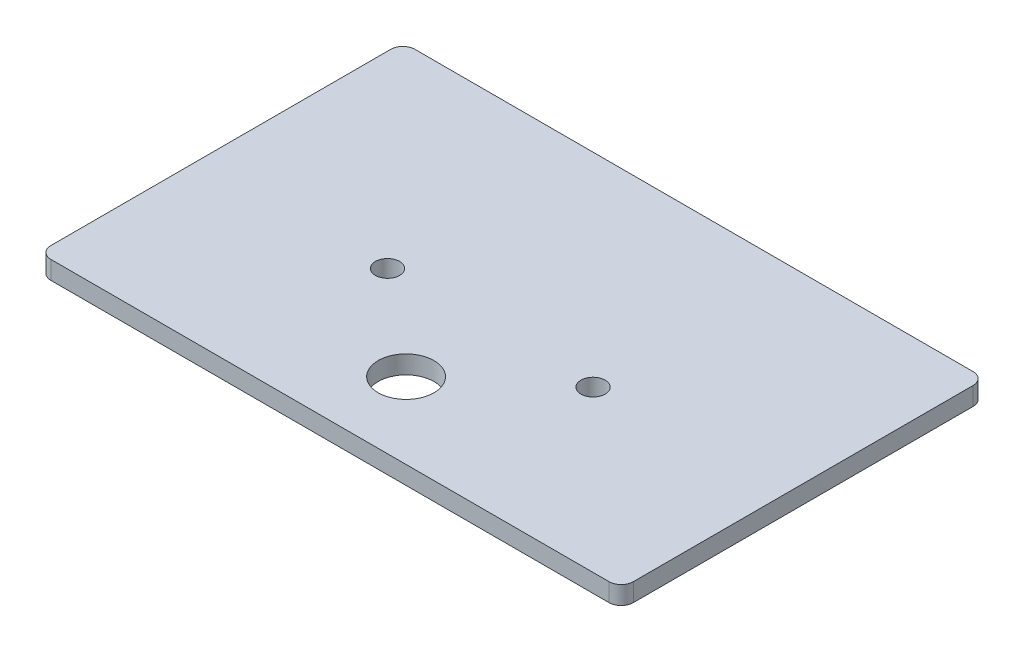
ISO-10303-21;
HEADER;
FILE_DESCRIPTION(('STEP AP214'),'2;1');
FILE_NAME('part.step','',(''),(''),'','','');
FILE_SCHEMA(('AUTOMOTIVE_DESIGN { 1 0 10303 214 1 1 1 1 }'));
ENDSEC;
DATA;
#1=APPLICATION_CONTEXT('core data for automotive mechanical design processes');
#2=APPLICATION_PROTOCOL_DEFINITION('international standard','automotive_design',2000,#1);
#3=PRODUCT_CONTEXT('',#1,'mechanical');
#4=PRODUCT('Part','Part','',(#3));
#5=PRODUCT_RELATED_PRODUCT_CATEGORY('part','',(#4));
#6=PRODUCT_DEFINITION_FORMATION('','',#4);
#7=PRODUCT_DEFINITION_CONTEXT('part definition',#1,'design');
#8=PRODUCT_DEFINITION('design','',#6,#7);
#9=PRODUCT_DEFINITION_SHAPE('','',#8);
#10=(LENGTH_UNIT() NAMED_UNIT(*) SI_UNIT(.MILLI.,.METRE.));
#11=(NAMED_UNIT(*) PLANE_ANGLE_UNIT() SI_UNIT($,.RADIAN.));
#12=(NAMED_UNIT(*) SI_UNIT($,.STERADIAN.) SOLID_ANGLE_UNIT());
#13=UNCERTAINTY_MEASURE_WITH_UNIT(LENGTH_MEASURE(1.E-05),#10,'distance_accuracy_value','');
#14=(GEOMETRIC_REPRESENTATION_CONTEXT(3) GLOBAL_UNCERTAINTY_ASSIGNED_CONTEXT((#13)) GLOBAL_UNIT_ASSIGNED_CONTEXT((#10,
#11,#12)) REPRESENTATION_CONTEXT('',''));
#15=CARTESIAN_POINT('',(0.,0.,0.));
#16=DIRECTION('',(0.,0.,1.));
#17=DIRECTION('',(1.,0.,0.));
#18=AXIS2_PLACEMENT_3D('',#15,#16,#17);
#19=CARTESIAN_POINT('',(36.,2.25,22.5));
#20=DIRECTION('',(-1.,0.,0.));
#21=DIRECTION('',(0.,0.,1.));
#22=AXIS2_PLACEMENT_3D('',#19,#20,#21);
#23=PLANE('',#22);
#24=DIRECTION('',(0.,0.,-1.));
#25=VECTOR('',#24,1.);
#26=CARTESIAN_POINT('',(36.,0.,22.5));
#27=LINE('',#26,#25);
#28=CARTESIAN_POINT('',(36.,0.,21.));
#29=VERTEX_POINT('',#28);
#30=CARTESIAN_POINT('',(36.,0.,-21.));
#31=VERTEX_POINT('',#30);
#32=EDGE_CURVE('E134',#29,#31,#27,.T.);
#33=ORIENTED_EDGE('',*,*,#32,.T.);
#34=DIRECTION('',(0.,-1.,0.));
#35=VECTOR('',#34,1.);
#36=CARTESIAN_POINT('',(36.,2.25,-21.));
#37=LINE('',#36,#35);
#38=CARTESIAN_POINT('',(36.,2.25,-21.));
#39=VERTEX_POINT('',#38);
#40=EDGE_CURVE('E152',#31,#39,#37,.F.);
#41=ORIENTED_EDGE('',*,*,#40,.T.);
#42=DIRECTION('',(0.,0.,-1.));
#43=VECTOR('',#42,1.);
#44=CARTESIAN_POINT('',(36.,2.25,22.5));
#45=LINE('',#44,#43);
#46=CARTESIAN_POINT('',(36.,2.25,21.));
#47=VERTEX_POINT('',#46);
#48=EDGE_CURVE('E132',#47,#39,#45,.T.);
#49=ORIENTED_EDGE('',*,*,#48,.F.);
#50=DIRECTION('',(0.,-1.,0.));
#51=VECTOR('',#50,1.);
#52=CARTESIAN_POINT('',(36.,2.25,21.));
#53=LINE('',#52,#51);
#54=EDGE_CURVE('E149',#47,#29,#53,.T.);
#55=ORIENTED_EDGE('',*,*,#54,.T.);
#56=EDGE_LOOP('',(#33,#41,#49,#55));
#57=FACE_BOUND('',#56,.T.);
#58=ADVANCED_FACE('F38',(#57),#23,.F.);
#59=CARTESIAN_POINT('',(-36.,2.25,-22.5));
#60=DIRECTION('',(0.,0.,1.));
#61=DIRECTION('',(1.,0.,0.));
#62=AXIS2_PLACEMENT_3D('',#59,#60,#61);
#63=PLANE('',#62);
#64=DIRECTION('',(-1.,0.,0.));
#65=VECTOR('',#64,1.);
#66=CARTESIAN_POINT('',(-36.,2.25,-22.5));
#67=LINE('',#66,#65);
#68=CARTESIAN_POINT('',(34.5,2.25,-22.5));
#69=VERTEX_POINT('',#68);
#70=CARTESIAN_POINT('',(-34.5,2.25,-22.5));
#71=VERTEX_POINT('',#70);
#72=EDGE_CURVE('E184',#69,#71,#67,.T.);
#73=ORIENTED_EDGE('',*,*,#72,.F.);
#74=DIRECTION('',(0.,-1.,0.));
#75=VECTOR('',#74,1.);
#76=CARTESIAN_POINT('',(34.5,2.25,-22.5));
#77=LINE('',#76,#75);
#78=CARTESIAN_POINT('',(34.5,0.,-22.5));
#79=VERTEX_POINT('',#78);
#80=EDGE_CURVE('E141',#69,#79,#77,.T.);
#81=ORIENTED_EDGE('',*,*,#80,.T.);
#82=DIRECTION('',(-1.,0.,0.));
#83=VECTOR('',#82,1.);
#84=CARTESIAN_POINT('',(-36.,0.,-22.5));
#85=LINE('',#84,#83);
#86=CARTESIAN_POINT('',(-34.5,0.,-22.5));
#87=VERTEX_POINT('',#86);
#88=EDGE_CURVE('E130',#79,#87,#85,.T.);
#89=ORIENTED_EDGE('',*,*,#88,.T.);
#90=DIRECTION('',(0.,-1.,0.));
#91=VECTOR('',#90,1.);
#92=CARTESIAN_POINT('',(-34.5,2.25,-22.5));
#93=LINE('',#92,#91);
#94=EDGE_CURVE('E112',#87,#71,#93,.F.);
#95=ORIENTED_EDGE('',*,*,#94,.T.);
#96=EDGE_LOOP('',(#73,#81,#89,#95));
#97=FACE_BOUND('',#96,.T.);
#98=ADVANCED_FACE('F200',(#97),#63,.F.);
#99=CARTESIAN_POINT('',(-36.,2.25,22.5));
#100=DIRECTION('',(1.,0.,0.));
#101=DIRECTION('',(0.,0.,-1.));
#102=AXIS2_PLACEMENT_3D('',#99,#100,#101);
#103=PLANE('',#102);
#104=DIRECTION('',(0.,0.,1.));
#105=VECTOR('',#104,1.);
#106=CARTESIAN_POINT('',(-36.,0.,22.5));
#107=LINE('',#106,#105);
#108=CARTESIAN_POINT('',(-36.,0.,-21.));
#109=VERTEX_POINT('',#108);
#110=CARTESIAN_POINT('',(-36.,0.,21.));
#111=VERTEX_POINT('',#110);
#112=EDGE_CURVE('E121',#109,#111,#107,.T.);
#113=ORIENTED_EDGE('',*,*,#112,.T.);
#114=DIRECTION('',(0.,-1.,0.));
#115=VECTOR('',#114,1.);
#116=CARTESIAN_POINT('',(-36.,2.25,21.));
#117=LINE('',#116,#115);
#118=CARTESIAN_POINT('',(-36.,2.25,21.));
#119=VERTEX_POINT('',#118);
#120=EDGE_CURVE('E11',#111,#119,#117,.F.);
#121=ORIENTED_EDGE('',*,*,#120,.T.);
#122=DIRECTION('',(0.,0.,1.));
#123=VECTOR('',#122,1.);
#124=CARTESIAN_POINT('',(-36.,2.25,22.5));
#125=LINE('',#124,#123);
#126=CARTESIAN_POINT('',(-36.,2.25,-21.));
#127=VERTEX_POINT('',#126);
#128=EDGE_CURVE('E123',#127,#119,#125,.T.);
#129=ORIENTED_EDGE('',*,*,#128,.F.);
#130=DIRECTION('',(0.,-1.,0.));
#131=VECTOR('',#130,1.);
#132=CARTESIAN_POINT('',(-36.,2.25,-21.));
#133=LINE('',#132,#131);
#134=EDGE_CURVE('E110',#127,#109,#133,.T.);
#135=ORIENTED_EDGE('',*,*,#134,.T.);
#136=EDGE_LOOP('',(#113,#121,#129,#135));
#137=FACE_BOUND('',#136,.T.);
#138=ADVANCED_FACE('F120',(#137),#103,.F.);
#139=CARTESIAN_POINT('',(-36.,2.25,22.5));
#140=DIRECTION('',(0.,0.,-1.));
#141=DIRECTION('',(-1.,0.,0.));
#142=AXIS2_PLACEMENT_3D('',#139,#140,#141);
#143=PLANE('',#142);
#144=DIRECTION('',(1.,0.,0.));
#145=VECTOR('',#144,1.);
#146=CARTESIAN_POINT('',(-36.,0.,22.5));
#147=LINE('',#146,#145);
#148=CARTESIAN_POINT('',(-34.5,0.,22.5));
#149=VERTEX_POINT('',#148);
#150=CARTESIAN_POINT('',(34.5,0.,22.5));
#151=VERTEX_POINT('',#150);
#152=EDGE_CURVE('E129',#149,#151,#147,.T.);
#153=ORIENTED_EDGE('',*,*,#152,.T.);
#154=DIRECTION('',(0.,-1.,0.));
#155=VECTOR('',#154,1.);
#156=CARTESIAN_POINT('',(34.5,2.25,22.5));
#157=LINE('',#156,#155);
#158=CARTESIAN_POINT('',(34.5,2.25,22.5));
#159=VERTEX_POINT('',#158);
#160=EDGE_CURVE('E47',#151,#159,#157,.F.);
#161=ORIENTED_EDGE('',*,*,#160,.T.);
#162=DIRECTION('',(1.,0.,0.));
#163=VECTOR('',#162,1.);
#164=CARTESIAN_POINT('',(-36.,2.25,22.5));
#165=LINE('',#164,#163);
#166=CARTESIAN_POINT('',(-34.5,2.25,22.5));
#167=VERTEX_POINT('',#166);
#168=EDGE_CURVE('E124',#167,#159,#165,.T.);
#169=ORIENTED_EDGE('',*,*,#168,.F.);
#170=DIRECTION('',(0.,-1.,0.));
#171=VECTOR('',#170,1.);
#172=CARTESIAN_POINT('',(-34.5,2.25,22.5));
#173=LINE('',#172,#171);
#174=EDGE_CURVE('E159',#167,#149,#173,.T.);
#175=ORIENTED_EDGE('',*,*,#174,.T.);
#176=EDGE_LOOP('',(#153,#161,#169,#175));
#177=FACE_BOUND('',#176,.T.);
#178=ADVANCED_FACE('F203',(#177),#143,.F.);
#179=CARTESIAN_POINT('',(0.,2.25,0.));
#180=DIRECTION('',(0.,-1.,0.));
#181=DIRECTION('',(0.,0.,-1.));
#182=AXIS2_PLACEMENT_3D('',#179,#180,#181);
#183=PLANE('',#182);
#184=CARTESIAN_POINT('',(-12.7348596341778,2.25,2.65687913250761));
#185=DIRECTION('',(0.,1.,0.));
#186=DIRECTION('',(0.,0.,1.));
#187=AXIS2_PLACEMENT_3D('',#184,#185,#186);
#188=CIRCLE('',#187,1.5);
#189=CARTESIAN_POINT('',(-12.7348596341778,2.25,4.15687913250761));
#190=VERTEX_POINT('',#189);
#191=EDGE_CURVE('E168',#190,#190,#188,.T.);
#192=ORIENTED_EDGE('',*,*,#191,.F.);
#193=EDGE_LOOP('',(#192));
#194=FACE_BOUND('',#193,.T.);
#195=CARTESIAN_POINT('',(12.682272564889,2.25,2.65687913250761));
#196=DIRECTION('',(0.,1.,0.));
#197=DIRECTION('',(0.,0.,1.));
#198=AXIS2_PLACEMENT_3D('',#195,#196,#197);
#199=CIRCLE('',#198,1.5);
#200=CARTESIAN_POINT('',(12.682272564889,2.25,4.15687913250761));
#201=VERTEX_POINT('',#200);
#202=EDGE_CURVE('E173',#201,#201,#199,.T.);
#203=ORIENTED_EDGE('',*,*,#202,.F.);
#204=EDGE_LOOP('',(#203));
#205=FACE_BOUND('',#204,.T.);
#206=CARTESIAN_POINT('',(0.,2.25,13.0972902551803));
#207=DIRECTION('',(0.,1.,0.));
#208=DIRECTION('',(0.,0.,1.));
#209=AXIS2_PLACEMENT_3D('',#206,#207,#208);
#210=CIRCLE('',#209,3.45);
#211=CARTESIAN_POINT('',(0.,2.25,16.5472902551803));
#212=VERTEX_POINT('',#211);
#213=EDGE_CURVE('E165',#212,#212,#210,.T.);
#214=ORIENTED_EDGE('',*,*,#213,.F.);
#215=EDGE_LOOP('',(#214));
#216=FACE_BOUND('',#215,.T.);
#217=ORIENTED_EDGE('',*,*,#48,.T.);
#218=CARTESIAN_POINT('',(34.5,2.25,-21.));
#219=DIRECTION('',(0.,-1.,0.));
#220=DIRECTION('',(0.,0.,-1.));
#221=AXIS2_PLACEMENT_3D('',#218,#219,#220);
#222=CIRCLE('',#221,1.5);
#223=EDGE_CURVE('E157',#39,#69,#222,.F.);
#224=ORIENTED_EDGE('',*,*,#223,.T.);
#225=ORIENTED_EDGE('',*,*,#72,.T.);
#226=CARTESIAN_POINT('',(-34.5,2.25,-21.));
#227=DIRECTION('',(0.,-1.,0.));
#228=DIRECTION('',(0.,0.,-1.));
#229=AXIS2_PLACEMENT_3D('',#226,#227,#228);
#230=CIRCLE('',#229,1.5);
#231=EDGE_CURVE('E139',#71,#127,#230,.F.);
#232=ORIENTED_EDGE('',*,*,#231,.T.);
#233=ORIENTED_EDGE('',*,*,#128,.T.);
#234=CARTESIAN_POINT('',(-34.5,2.25,21.));
#235=DIRECTION('',(0.,-1.,0.));
#236=DIRECTION('',(0.,0.,-1.));
#237=AXIS2_PLACEMENT_3D('',#234,#235,#236);
#238=CIRCLE('',#237,1.5);
#239=EDGE_CURVE('E61',#119,#167,#238,.F.);
#240=ORIENTED_EDGE('',*,*,#239,.T.);
#241=ORIENTED_EDGE('',*,*,#168,.T.);
#242=CARTESIAN_POINT('',(34.5,2.25,21.));
#243=DIRECTION('',(0.,-1.,0.));
#244=DIRECTION('',(0.,0.,-1.));
#245=AXIS2_PLACEMENT_3D('',#242,#243,#244);
#246=CIRCLE('',#245,1.5);
#247=EDGE_CURVE('E155',#159,#47,#246,.F.);
#248=ORIENTED_EDGE('',*,*,#247,.T.);
#249=EDGE_LOOP('',(#217,#224,#225,#232,#233,#240,#241,#248));
#250=FACE_BOUND('',#249,.T.);
#251=ADVANCED_FACE('F198',(#194,#205,#216,#250),#183,.F.);
#252=CARTESIAN_POINT('',(0.,0.,0.));
#253=DIRECTION('',(0.,-1.,0.));
#254=DIRECTION('',(0.,0.,-1.));
#255=AXIS2_PLACEMENT_3D('',#252,#253,#254);
#256=PLANE('',#255);
#257=CARTESIAN_POINT('',(-12.7348596341778,0.,2.65687913250761));
#258=DIRECTION('',(0.,-1.,0.));
#259=DIRECTION('',(0.,0.,-1.));
#260=AXIS2_PLACEMENT_3D('',#257,#258,#259);
#261=CIRCLE('',#260,1.5);
#262=CARTESIAN_POINT('',(-12.7348596341778,0.,1.15687913250761));
#263=VERTEX_POINT('',#262);
#264=EDGE_CURVE('E42',#263,#263,#261,.T.);
#265=ORIENTED_EDGE('',*,*,#264,.F.);
#266=EDGE_LOOP('',(#265));
#267=FACE_BOUND('',#266,.T.);
#268=CARTESIAN_POINT('',(12.682272564889,0.,2.65687913250761));
#269=DIRECTION('',(0.,-1.,0.));
#270=DIRECTION('',(0.,0.,-1.));
#271=AXIS2_PLACEMENT_3D('',#268,#269,#270);
#272=CIRCLE('',#271,1.5);
#273=CARTESIAN_POINT('',(12.682272564889,0.,1.15687913250761));
#274=VERTEX_POINT('',#273);
#275=EDGE_CURVE('E166',#274,#274,#272,.T.);
#276=ORIENTED_EDGE('',*,*,#275,.F.);
#277=EDGE_LOOP('',(#276));
#278=FACE_BOUND('',#277,.T.);
#279=CARTESIAN_POINT('',(0.,0.,13.0972902551803));
#280=DIRECTION('',(0.,-1.,0.));
#281=DIRECTION('',(0.,0.,-1.));
#282=AXIS2_PLACEMENT_3D('',#279,#280,#281);
#283=CIRCLE('',#282,3.45);
#284=CARTESIAN_POINT('',(0.,0.,9.64729025518034));
#285=VERTEX_POINT('',#284);
#286=EDGE_CURVE('E163',#285,#285,#283,.T.);
#287=ORIENTED_EDGE('',*,*,#286,.F.);
#288=EDGE_LOOP('',(#287));
#289=FACE_BOUND('',#288,.T.);
#290=ORIENTED_EDGE('',*,*,#88,.F.);
#291=CARTESIAN_POINT('',(34.5,0.,-21.));
#292=DIRECTION('',(0.,-1.,0.));
#293=DIRECTION('',(0.,0.,-1.));
#294=AXIS2_PLACEMENT_3D('',#291,#292,#293);
#295=CIRCLE('',#294,1.5);
#296=EDGE_CURVE('E147',#79,#31,#295,.T.);
#297=ORIENTED_EDGE('',*,*,#296,.T.);
#298=ORIENTED_EDGE('',*,*,#32,.F.);
#299=CARTESIAN_POINT('',(34.5,0.,21.));
#300=DIRECTION('',(0.,-1.,0.));
#301=DIRECTION('',(0.,0.,-1.));
#302=AXIS2_PLACEMENT_3D('',#299,#300,#301);
#303=CIRCLE('',#302,1.5);
#304=EDGE_CURVE('E145',#29,#151,#303,.T.);
#305=ORIENTED_EDGE('',*,*,#304,.T.);
#306=ORIENTED_EDGE('',*,*,#152,.F.);
#307=CARTESIAN_POINT('',(-34.5,0.,21.));
#308=DIRECTION('',(0.,-1.,0.));
#309=DIRECTION('',(0.,0.,-1.));
#310=AXIS2_PLACEMENT_3D('',#307,#308,#309);
#311=CIRCLE('',#310,1.5);
#312=EDGE_CURVE('E128',#149,#111,#311,.T.);
#313=ORIENTED_EDGE('',*,*,#312,.T.);
#314=ORIENTED_EDGE('',*,*,#112,.F.);
#315=CARTESIAN_POINT('',(-34.5,0.,-21.));
#316=DIRECTION('',(0.,-1.,0.));
#317=DIRECTION('',(0.,0.,-1.));
#318=AXIS2_PLACEMENT_3D('',#315,#316,#317);
#319=CIRCLE('',#318,1.5);
#320=EDGE_CURVE('E106',#109,#87,#319,.T.);
#321=ORIENTED_EDGE('',*,*,#320,.T.);
#322=EDGE_LOOP('',(#290,#297,#298,#305,#306,#313,#314,#321));
#323=FACE_BOUND('',#322,.T.);
#324=ADVANCED_FACE('F126',(#267,#278,#289,#323),#256,.T.);
#325=CARTESIAN_POINT('',(-34.5,2.25,-21.));
#326=DIRECTION('',(0.,-1.,0.));
#327=DIRECTION('',(0.,0.,-1.));
#328=AXIS2_PLACEMENT_3D('',#325,#326,#327);
#329=CYLINDRICAL_SURFACE('',#328,1.5);
#330=ORIENTED_EDGE('',*,*,#231,.F.);
#331=ORIENTED_EDGE('',*,*,#94,.F.);
#332=ORIENTED_EDGE('',*,*,#320,.F.);
#333=ORIENTED_EDGE('',*,*,#134,.F.);
#334=EDGE_LOOP('',(#330,#331,#332,#333));
#335=FACE_BOUND('',#334,.T.);
#336=ADVANCED_FACE('F109',(#335),#329,.T.);
#337=CARTESIAN_POINT('',(34.5,2.25,-21.));
#338=DIRECTION('',(0.,-1.,0.));
#339=DIRECTION('',(0.,0.,-1.));
#340=AXIS2_PLACEMENT_3D('',#337,#338,#339);
#341=CYLINDRICAL_SURFACE('',#340,1.5);
#342=ORIENTED_EDGE('',*,*,#223,.F.);
#343=ORIENTED_EDGE('',*,*,#40,.F.);
#344=ORIENTED_EDGE('',*,*,#296,.F.);
#345=ORIENTED_EDGE('',*,*,#80,.F.);
#346=EDGE_LOOP('',(#342,#343,#344,#345));
#347=FACE_BOUND('',#346,.T.);
#348=ADVANCED_FACE('F195',(#347),#341,.T.);
#349=CARTESIAN_POINT('',(34.5,2.25,21.));
#350=DIRECTION('',(0.,-1.,0.));
#351=DIRECTION('',(0.,0.,-1.));
#352=AXIS2_PLACEMENT_3D('',#349,#350,#351);
#353=CYLINDRICAL_SURFACE('',#352,1.5);
#354=ORIENTED_EDGE('',*,*,#247,.F.);
#355=ORIENTED_EDGE('',*,*,#160,.F.);
#356=ORIENTED_EDGE('',*,*,#304,.F.);
#357=ORIENTED_EDGE('',*,*,#54,.F.);
#358=EDGE_LOOP('',(#354,#355,#356,#357));
#359=FACE_BOUND('',#358,.T.);
#360=ADVANCED_FACE('F206',(#359),#353,.T.);
#361=CARTESIAN_POINT('',(-34.5,2.25,21.));
#362=DIRECTION('',(0.,-1.,0.));
#363=DIRECTION('',(0.,0.,-1.));
#364=AXIS2_PLACEMENT_3D('',#361,#362,#363);
#365=CYLINDRICAL_SURFACE('',#364,1.5);
#366=ORIENTED_EDGE('',*,*,#239,.F.);
#367=ORIENTED_EDGE('',*,*,#120,.F.);
#368=ORIENTED_EDGE('',*,*,#312,.F.);
#369=ORIENTED_EDGE('',*,*,#174,.F.);
#370=EDGE_LOOP('',(#366,#367,#368,#369));
#371=FACE_BOUND('',#370,.T.);
#372=ADVANCED_FACE('F40',(#371),#365,.T.);
#373=CARTESIAN_POINT('',(0.,-7.75,13.0972902551803));
#374=DIRECTION('',(0.,1.,0.));
#375=DIRECTION('',(0.,0.,1.));
#376=AXIS2_PLACEMENT_3D('',#373,#374,#375);
#377=CYLINDRICAL_SURFACE('',#376,3.45);
#378=ORIENTED_EDGE('',*,*,#286,.T.);
#379=EDGE_LOOP('',(#378));
#380=FACE_BOUND('',#379,.T.);
#381=ORIENTED_EDGE('',*,*,#213,.T.);
#382=EDGE_LOOP('',(#381));
#383=FACE_BOUND('',#382,.T.);
#384=ADVANCED_FACE('F212',(#380,#383),#377,.F.);
#385=CARTESIAN_POINT('',(12.682272564889,-7.75,2.65687913250761));
#386=DIRECTION('',(0.,1.,0.));
#387=DIRECTION('',(0.,0.,1.));
#388=AXIS2_PLACEMENT_3D('',#385,#386,#387);
#389=CYLINDRICAL_SURFACE('',#388,1.5);
#390=ORIENTED_EDGE('',*,*,#275,.T.);
#391=EDGE_LOOP('',(#390));
#392=FACE_BOUND('',#391,.T.);
#393=ORIENTED_EDGE('',*,*,#202,.T.);
#394=EDGE_LOOP('',(#393));
#395=FACE_BOUND('',#394,.T.);
#396=ADVANCED_FACE('F284',(#392,#395),#389,.F.);
#397=CARTESIAN_POINT('',(-12.7348596341778,-7.75,2.65687913250761));
#398=DIRECTION('',(0.,1.,0.));
#399=DIRECTION('',(0.,0.,1.));
#400=AXIS2_PLACEMENT_3D('',#397,#398,#399);
#401=CYLINDRICAL_SURFACE('',#400,1.5);
#402=ORIENTED_EDGE('',*,*,#264,.T.);
#403=EDGE_LOOP('',(#402));
#404=FACE_BOUND('',#403,.T.);
#405=ORIENTED_EDGE('',*,*,#191,.T.);
#406=EDGE_LOOP('',(#405));
#407=FACE_BOUND('',#406,.T.);
#408=ADVANCED_FACE('F291',(#404,#407),#401,.F.);
#409=CLOSED_SHELL('',(#58,#98,#138,#178,#251,#324,#336,#348,#360,#372,#384,#396,#408));
#410=MANIFOLD_SOLID_BREP('B2',#409);
#411=ADVANCED_BREP_SHAPE_REPRESENTATION('',(#18,#410),#14);
#412=SHAPE_DEFINITION_REPRESENTATION(#9,#411);
ENDSEC;
END-ISO-10303-21;
